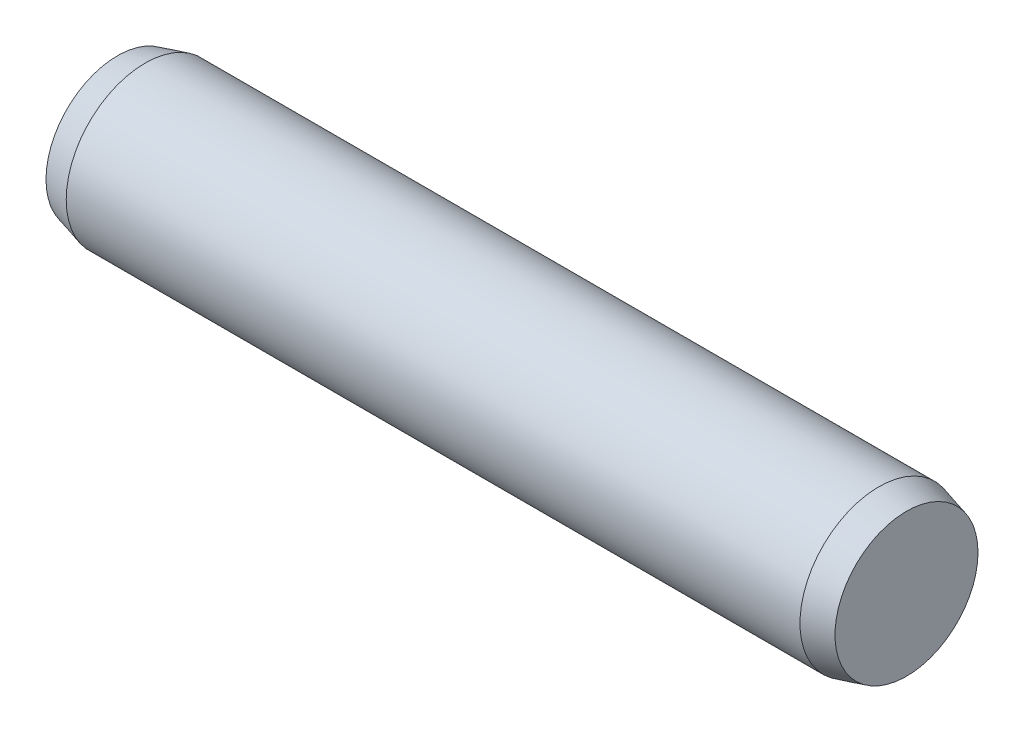
ISO-10303-21;
HEADER;
FILE_DESCRIPTION(('STEP AP214'),'2;1');
FILE_NAME('part.step','',(''),(''),'','','');
FILE_SCHEMA(('AUTOMOTIVE_DESIGN { 1 0 10303 214 1 1 1 1 }'));
ENDSEC;
DATA;
#1=APPLICATION_CONTEXT('core data for automotive mechanical design processes');
#2=APPLICATION_PROTOCOL_DEFINITION('international standard','automotive_design',2000,#1);
#3=PRODUCT_CONTEXT('',#1,'mechanical');
#4=PRODUCT('Part','Part','',(#3));
#5=PRODUCT_RELATED_PRODUCT_CATEGORY('part','',(#4));
#6=PRODUCT_DEFINITION_FORMATION('','',#4);
#7=PRODUCT_DEFINITION_CONTEXT('part definition',#1,'design');
#8=PRODUCT_DEFINITION('design','',#6,#7);
#9=PRODUCT_DEFINITION_SHAPE('','',#8);
#10=(LENGTH_UNIT() NAMED_UNIT(*) SI_UNIT(.MILLI.,.METRE.));
#11=(NAMED_UNIT(*) PLANE_ANGLE_UNIT() SI_UNIT($,.RADIAN.));
#12=(NAMED_UNIT(*) SI_UNIT($,.STERADIAN.) SOLID_ANGLE_UNIT());
#13=UNCERTAINTY_MEASURE_WITH_UNIT(LENGTH_MEASURE(1.E-05),#10,'distance_accuracy_value','');
#14=(GEOMETRIC_REPRESENTATION_CONTEXT(3) GLOBAL_UNCERTAINTY_ASSIGNED_CONTEXT((#13)) GLOBAL_UNIT_ASSIGNED_CONTEXT((#10,
#11,#12)) REPRESENTATION_CONTEXT('',''));
#15=CARTESIAN_POINT('',(0.,0.,0.));
#16=DIRECTION('',(0.,0.,1.));
#17=DIRECTION('',(1.,0.,0.));
#18=AXIS2_PLACEMENT_3D('',#15,#16,#17);
#19=CARTESIAN_POINT('',(-4.65,0.,0.));
#20=DIRECTION('',(1.,0.,0.));
#21=DIRECTION('',(0.,0.,-1.));
#22=AXIS2_PLACEMENT_3D('',#19,#20,#21);
#23=CYLINDRICAL_SURFACE('',#22,1.);
#24=CARTESIAN_POINT('',(-4.65,0.,0.));
#25=DIRECTION('',(-1.,0.,0.));
#26=DIRECTION('',(0.,0.,1.));
#27=AXIS2_PLACEMENT_3D('',#24,#25,#26);
#28=CIRCLE('',#27,1.);
#29=CARTESIAN_POINT('',(-4.65,0.,1.));
#30=VERTEX_POINT('',#29);
#31=EDGE_CURVE('E49',#30,#30,#28,.T.);
#32=ORIENTED_EDGE('',*,*,#31,.F.);
#33=EDGE_LOOP('',(#32));
#34=FACE_BOUND('',#33,.T.);
#35=CARTESIAN_POINT('',(4.65,0.,0.));
#36=DIRECTION('',(1.,0.,0.));
#37=DIRECTION('',(0.,0.,-1.));
#38=AXIS2_PLACEMENT_3D('',#35,#36,#37);
#39=CIRCLE('',#38,1.);
#40=CARTESIAN_POINT('',(4.65,0.,-1.));
#41=VERTEX_POINT('',#40);
#42=EDGE_CURVE('E10',#41,#41,#39,.T.);
#43=ORIENTED_EDGE('',*,*,#42,.F.);
#44=EDGE_LOOP('',(#43));
#45=FACE_BOUND('',#44,.T.);
#46=ADVANCED_FACE('F35',(#34,#45),#23,.T.);
#47=CARTESIAN_POINT('',(4.65,0.,0.));
#48=DIRECTION('',(-1.,0.,0.));
#49=DIRECTION('',(0.,0.,-1.));
#50=AXIS2_PLACEMENT_3D('',#47,#48,#49);
#51=CONICAL_SURFACE('',#50,1.,0.26179938779915);
#52=CARTESIAN_POINT('',(5.,0.,0.));
#53=DIRECTION('',(1.,0.,0.));
#54=DIRECTION('',(0.,0.,-1.));
#55=AXIS2_PLACEMENT_3D('',#52,#53,#54);
#56=CIRCLE('',#55,0.906217782649109);
#57=CARTESIAN_POINT('',(5.,0.,-0.906217782649109));
#58=VERTEX_POINT('',#57);
#59=EDGE_CURVE('E41',#58,#58,#56,.T.);
#60=ORIENTED_EDGE('',*,*,#59,.F.);
#61=EDGE_LOOP('',(#60));
#62=FACE_BOUND('',#61,.T.);
#63=ORIENTED_EDGE('',*,*,#42,.T.);
#64=EDGE_LOOP('',(#63));
#65=FACE_BOUND('',#64,.T.);
#66=ADVANCED_FACE('F59',(#62,#65),#51,.T.);
#67=CARTESIAN_POINT('',(5.,0.,0.));
#68=DIRECTION('',(1.,0.,0.));
#69=DIRECTION('',(0.,0.,-1.));
#70=AXIS2_PLACEMENT_3D('',#67,#68,#69);
#71=PLANE('',#70);
#72=ORIENTED_EDGE('',*,*,#59,.T.);
#73=EDGE_LOOP('',(#72));
#74=FACE_BOUND('',#73,.T.);
#75=ADVANCED_FACE('F63',(#74),#71,.T.);
#76=CARTESIAN_POINT('',(-4.65,0.,0.));
#77=DIRECTION('',(1.,0.,0.));
#78=DIRECTION('',(0.,0.,1.));
#79=AXIS2_PLACEMENT_3D('',#76,#77,#78);
#80=CONICAL_SURFACE('',#79,1.,0.26179938779915);
#81=CARTESIAN_POINT('',(-5.,0.,0.));
#82=DIRECTION('',(-1.,0.,0.));
#83=DIRECTION('',(0.,0.,1.));
#84=AXIS2_PLACEMENT_3D('',#81,#82,#83);
#85=CIRCLE('',#84,0.906217782649108);
#86=CARTESIAN_POINT('',(-5.,0.,0.906217782649108));
#87=VERTEX_POINT('',#86);
#88=EDGE_CURVE('E45',#87,#87,#85,.T.);
#89=ORIENTED_EDGE('',*,*,#88,.F.);
#90=EDGE_LOOP('',(#89));
#91=FACE_BOUND('',#90,.T.);
#92=ORIENTED_EDGE('',*,*,#31,.T.);
#93=EDGE_LOOP('',(#92));
#94=FACE_BOUND('',#93,.T.);
#95=ADVANCED_FACE('F55',(#91,#94),#80,.T.);
#96=CARTESIAN_POINT('',(-5.,0.,0.));
#97=DIRECTION('',(-1.,0.,0.));
#98=DIRECTION('',(0.,0.,1.));
#99=AXIS2_PLACEMENT_3D('',#96,#97,#98);
#100=PLANE('',#99);
#101=ORIENTED_EDGE('',*,*,#88,.T.);
#102=EDGE_LOOP('',(#101));
#103=FACE_BOUND('',#102,.T.);
#104=ADVANCED_FACE('F72',(#103),#100,.T.);
#105=CLOSED_SHELL('',(#46,#66,#75,#95,#104));
#106=MANIFOLD_SOLID_BREP('B2',#105);
#107=ADVANCED_BREP_SHAPE_REPRESENTATION('',(#18,#106),#14);
#108=SHAPE_DEFINITION_REPRESENTATION(#9,#107);
ENDSEC;
END-ISO-10303-21;
